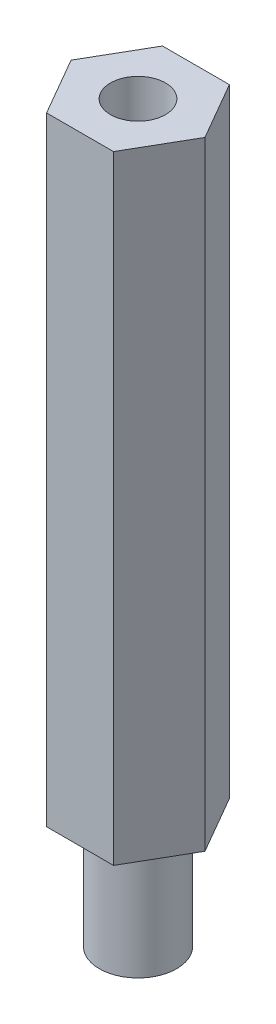
ISO-10303-21;
HEADER;
FILE_DESCRIPTION(('STEP AP214'),'2;1');
FILE_NAME('part.step','',(''),(''),'','','');
FILE_SCHEMA(('AUTOMOTIVE_DESIGN { 1 0 10303 214 1 1 1 1 }'));
ENDSEC;
DATA;
#1=APPLICATION_CONTEXT('core data for automotive mechanical design processes');
#2=APPLICATION_PROTOCOL_DEFINITION('international standard','automotive_design',2000,#1);
#3=PRODUCT_CONTEXT('',#1,'mechanical');
#4=PRODUCT('Part','Part','',(#3));
#5=PRODUCT_RELATED_PRODUCT_CATEGORY('part','',(#4));
#6=PRODUCT_DEFINITION_FORMATION('','',#4);
#7=PRODUCT_DEFINITION_CONTEXT('part definition',#1,'design');
#8=PRODUCT_DEFINITION('design','',#6,#7);
#9=PRODUCT_DEFINITION_SHAPE('','',#8);
#10=(LENGTH_UNIT() NAMED_UNIT(*) SI_UNIT(.MILLI.,.METRE.));
#11=(NAMED_UNIT(*) PLANE_ANGLE_UNIT() SI_UNIT($,.RADIAN.));
#12=(NAMED_UNIT(*) SI_UNIT($,.STERADIAN.) SOLID_ANGLE_UNIT());
#13=UNCERTAINTY_MEASURE_WITH_UNIT(LENGTH_MEASURE(1.E-05),#10,'distance_accuracy_value','');
#14=(GEOMETRIC_REPRESENTATION_CONTEXT(3) GLOBAL_UNCERTAINTY_ASSIGNED_CONTEXT((#13)) GLOBAL_UNIT_ASSIGNED_CONTEXT((#10,
#11,#12)) REPRESENTATION_CONTEXT('',''));
#15=CARTESIAN_POINT('',(0.,0.,0.));
#16=DIRECTION('',(0.,0.,1.));
#17=DIRECTION('',(1.,0.,0.));
#18=AXIS2_PLACEMENT_3D('',#15,#16,#17);
#19=CARTESIAN_POINT('',(0.,19.958347242,0.));
#20=DIRECTION('',(0.,1.,0.));
#21=DIRECTION('',(0.,0.,1.));
#22=AXIS2_PLACEMENT_3D('',#19,#20,#21);
#23=CONICAL_SURFACE('',#22,0.,1.02974425847309);
#24=CARTESIAN_POINT('',(0.,19.958347242,0.));
#25=VERTEX_POINT('',#24);
#26=VERTEX_LOOP('',#25);
#27=FACE_BOUND('',#26,.T.);
#28=CARTESIAN_POINT('',(0.,20.6375,0.));
#29=DIRECTION('',(0.,1.,0.));
#30=DIRECTION('',(0.,0.,1.));
#31=AXIS2_PLACEMENT_3D('',#28,#29,#30);
#32=CIRCLE('',#31,1.1303);
#33=CARTESIAN_POINT('',(0.,20.6375,1.1303));
#34=VERTEX_POINT('',#33);
#35=EDGE_CURVE('E88',#34,#34,#32,.F.);
#36=ORIENTED_EDGE('',*,*,#35,.F.);
#37=EDGE_LOOP('',(#36));
#38=FACE_BOUND('',#37,.T.);
#39=ADVANCED_FACE('F17',(#27,#38),#23,.F.);
#40=CARTESIAN_POINT('',(0.,20.6375,0.));
#41=DIRECTION('',(0.,1.,0.));
#42=DIRECTION('',(0.,0.,1.));
#43=AXIS2_PLACEMENT_3D('',#40,#41,#42);
#44=CYLINDRICAL_SURFACE('',#43,1.1303);
#45=ORIENTED_EDGE('',*,*,#35,.T.);
#46=EDGE_LOOP('',(#45));
#47=FACE_BOUND('',#46,.T.);
#48=CARTESIAN_POINT('',(0.,25.4,0.));
#49=DIRECTION('',(0.,1.,0.));
#50=DIRECTION('',(0.,0.,1.));
#51=AXIS2_PLACEMENT_3D('',#48,#49,#50);
#52=CIRCLE('',#51,1.1303);
#53=CARTESIAN_POINT('',(0.,25.4,1.1303));
#54=VERTEX_POINT('',#53);
#55=EDGE_CURVE('E21',#54,#54,#52,.T.);
#56=ORIENTED_EDGE('',*,*,#55,.T.);
#57=EDGE_LOOP('',(#56));
#58=FACE_BOUND('',#57,.T.);
#59=ADVANCED_FACE('F84',(#47,#58),#44,.F.);
#60=CARTESIAN_POINT('',(-2.782626225,25.4,2.38125));
#61=DIRECTION('',(0.,-1.,0.));
#62=DIRECTION('',(0.,0.,-1.));
#63=AXIS2_PLACEMENT_3D('',#60,#61,#62);
#64=PLANE('',#63);
#65=ORIENTED_EDGE('',*,*,#55,.F.);
#66=EDGE_LOOP('',(#65));
#67=FACE_BOUND('',#66,.T.);
#68=DIRECTION('',(0.499999999861491,0.,0.866025403864407));
#69=VECTOR('',#68,1.);
#70=CARTESIAN_POINT('',(-2.062222993,25.4,1.190625));
#71=LINE('',#70,#69);
#72=CARTESIAN_POINT('',(-2.74963065629974,25.4,6.71976851333161E-10));
#73=VERTEX_POINT('',#72);
#74=CARTESIAN_POINT('',(-1.3748153284377,25.4,2.38125));
#75=VERTEX_POINT('',#74);
#76=EDGE_CURVE('E65',#73,#75,#71,.T.);
#77=ORIENTED_EDGE('',*,*,#76,.T.);
#78=DIRECTION('',(1.,0.,0.));
#79=VECTOR('',#78,1.);
#80=CARTESIAN_POINT('',(0.,25.4,2.38125));
#81=LINE('',#80,#79);
#82=CARTESIAN_POINT('',(1.3748153284377,25.4,2.38125));
#83=VERTEX_POINT('',#82);
#84=EDGE_CURVE('E117',#75,#83,#81,.T.);
#85=ORIENTED_EDGE('',*,*,#84,.T.);
#86=DIRECTION('',(0.499999999861491,0.,-0.866025403864407));
#87=VECTOR('',#86,1.);
#88=CARTESIAN_POINT('',(2.062222993,25.4,1.190625));
#89=LINE('',#88,#87);
#90=CARTESIAN_POINT('',(2.74963065559947,25.4,-1.34395362135116E-09));
#91=VERTEX_POINT('',#90);
#92=EDGE_CURVE('E114',#83,#91,#89,.T.);
#93=ORIENTED_EDGE('',*,*,#92,.T.);
#94=DIRECTION('',(-0.499999999861491,0.,-0.866025403864407));
#95=VECTOR('',#94,1.);
#96=CARTESIAN_POINT('',(2.062222993,25.4,-1.190625));
#97=LINE('',#96,#95);
#98=CARTESIAN_POINT('',(1.3748153284377,25.4,-2.38125));
#99=VERTEX_POINT('',#98);
#100=EDGE_CURVE('E107',#91,#99,#97,.T.);
#101=ORIENTED_EDGE('',*,*,#100,.T.);
#102=DIRECTION('',(-1.,0.,0.));
#103=VECTOR('',#102,1.);
#104=CARTESIAN_POINT('',(0.,25.4,-2.38125));
#105=LINE('',#104,#103);
#106=CARTESIAN_POINT('',(-1.3748153284377,25.4,-2.38125));
#107=VERTEX_POINT('',#106);
#108=EDGE_CURVE('E78',#99,#107,#105,.T.);
#109=ORIENTED_EDGE('',*,*,#108,.T.);
#110=DIRECTION('',(-0.499999999861491,0.,0.866025403864407));
#111=VECTOR('',#110,1.);
#112=CARTESIAN_POINT('',(-2.062222993,25.4,-1.190625));
#113=LINE('',#112,#111);
#114=EDGE_CURVE('E92',#107,#73,#113,.T.);
#115=ORIENTED_EDGE('',*,*,#114,.T.);
#116=EDGE_LOOP('',(#77,#85,#93,#101,#109,#115));
#117=FACE_BOUND('',#116,.T.);
#118=ADVANCED_FACE('F168',(#67,#117),#64,.F.);
#119=CARTESIAN_POINT('',(-2.749630657,0.,0.));
#120=DIRECTION('',(0.866025403864407,0.,0.499999999861491));
#121=DIRECTION('',(0.499999999861491,0.,-0.866025403864407));
#122=AXIS2_PLACEMENT_3D('',#119,#120,#121);
#123=PLANE('',#122);
#124=DIRECTION('',(0.,1.,0.));
#125=VECTOR('',#124,1.);
#126=CARTESIAN_POINT('',(-2.749630657,12.7,0.));
#127=LINE('',#126,#125);
#128=CARTESIAN_POINT('',(-2.74963065614118,0.,-1.35229067527165E-10));
#129=VERTEX_POINT('',#128);
#130=EDGE_CURVE('E102',#129,#73,#127,.T.);
#131=ORIENTED_EDGE('',*,*,#130,.T.);
#132=ORIENTED_EDGE('',*,*,#114,.F.);
#133=DIRECTION('',(0.,-1.,0.));
#134=VECTOR('',#133,1.);
#135=CARTESIAN_POINT('',(-1.374815329,12.7,-2.38125));
#136=LINE('',#135,#134);
#137=CARTESIAN_POINT('',(-1.3748153284377,0.,-2.38125));
#138=VERTEX_POINT('',#137);
#139=EDGE_CURVE('E105',#107,#138,#136,.T.);
#140=ORIENTED_EDGE('',*,*,#139,.T.);
#141=DIRECTION('',(0.499999999827506,0.,-0.866025403884028));
#142=VECTOR('',#141,1.);
#143=CARTESIAN_POINT('',(-2.74963065575081,0.,0.));
#144=LINE('',#143,#142);
#145=EDGE_CURVE('E56',#129,#138,#144,.T.);
#146=ORIENTED_EDGE('',*,*,#145,.F.);
#147=EDGE_LOOP('',(#131,#132,#140,#146));
#148=FACE_BOUND('',#147,.T.);
#149=ADVANCED_FACE('F131',(#148),#123,.F.);
#150=CARTESIAN_POINT('',(-1.374815329,0.,-2.38125));
#151=DIRECTION('',(0.,0.,1.));
#152=DIRECTION('',(1.,0.,0.));
#153=AXIS2_PLACEMENT_3D('',#150,#151,#152);
#154=PLANE('',#153);
#155=ORIENTED_EDGE('',*,*,#139,.F.);
#156=ORIENTED_EDGE('',*,*,#108,.F.);
#157=DIRECTION('',(0.,-1.,0.));
#158=VECTOR('',#157,1.);
#159=CARTESIAN_POINT('',(1.374815329,12.7,-2.38125));
#160=LINE('',#159,#158);
#161=CARTESIAN_POINT('',(1.3748153284377,0.,-2.38125));
#162=VERTEX_POINT('',#161);
#163=EDGE_CURVE('E112',#99,#162,#160,.T.);
#164=ORIENTED_EDGE('',*,*,#163,.T.);
#165=DIRECTION('',(1.,0.,0.));
#166=VECTOR('',#165,1.);
#167=CARTESIAN_POINT('',(0.,0.,-2.38125));
#168=LINE('',#167,#166);
#169=EDGE_CURVE('E108',#138,#162,#168,.T.);
#170=ORIENTED_EDGE('',*,*,#169,.F.);
#171=EDGE_LOOP('',(#155,#156,#164,#170));
#172=FACE_BOUND('',#171,.T.);
#173=ADVANCED_FACE('F134',(#172),#154,.F.);
#174=CARTESIAN_POINT('',(1.374815329,0.,-2.38125));
#175=DIRECTION('',(-0.866025403864407,0.,0.499999999861491));
#176=DIRECTION('',(0.499999999861491,0.,0.866025403864407));
#177=AXIS2_PLACEMENT_3D('',#174,#175,#176);
#178=PLANE('',#177);
#179=ORIENTED_EDGE('',*,*,#163,.F.);
#180=ORIENTED_EDGE('',*,*,#100,.F.);
#181=DIRECTION('',(0.,-1.,0.));
#182=VECTOR('',#181,1.);
#183=CARTESIAN_POINT('',(2.749630657,12.7,0.));
#184=LINE('',#183,#182);
#185=CARTESIAN_POINT('',(2.74963065614118,0.,-1.35228892435423E-10));
#186=VERTEX_POINT('',#185);
#187=EDGE_CURVE('E115',#91,#186,#184,.T.);
#188=ORIENTED_EDGE('',*,*,#187,.T.);
#189=DIRECTION('',(0.499999999827506,0.,0.866025403884028));
#190=VECTOR('',#189,1.);
#191=CARTESIAN_POINT('',(1.3748153278754,0.,-2.38125));
#192=LINE('',#191,#190);
#193=EDGE_CURVE('E111',#162,#186,#192,.T.);
#194=ORIENTED_EDGE('',*,*,#193,.F.);
#195=EDGE_LOOP('',(#179,#180,#188,#194));
#196=FACE_BOUND('',#195,.T.);
#197=ADVANCED_FACE('F139',(#196),#178,.F.);
#198=CARTESIAN_POINT('',(2.749630657,0.,0.));
#199=DIRECTION('',(-0.866025403864407,0.,-0.499999999861491));
#200=DIRECTION('',(-0.499999999861491,0.,0.866025403864407));
#201=AXIS2_PLACEMENT_3D('',#198,#199,#200);
#202=PLANE('',#201);
#203=ORIENTED_EDGE('',*,*,#187,.F.);
#204=ORIENTED_EDGE('',*,*,#92,.F.);
#205=DIRECTION('',(0.,-1.,0.));
#206=VECTOR('',#205,1.);
#207=CARTESIAN_POINT('',(1.374815329,12.7,2.38125));
#208=LINE('',#207,#206);
#209=CARTESIAN_POINT('',(1.3748153284377,0.,2.38125));
#210=VERTEX_POINT('',#209);
#211=EDGE_CURVE('E104',#83,#210,#208,.T.);
#212=ORIENTED_EDGE('',*,*,#211,.T.);
#213=DIRECTION('',(-0.499999999827506,0.,0.866025403884028));
#214=VECTOR('',#213,1.);
#215=CARTESIAN_POINT('',(2.74963065575081,0.,0.));
#216=LINE('',#215,#214);
#217=EDGE_CURVE('E101',#186,#210,#216,.T.);
#218=ORIENTED_EDGE('',*,*,#217,.F.);
#219=EDGE_LOOP('',(#203,#204,#212,#218));
#220=FACE_BOUND('',#219,.T.);
#221=ADVANCED_FACE('F143',(#220),#202,.F.);
#222=CARTESIAN_POINT('',(1.374815329,0.,2.38125));
#223=DIRECTION('',(0.,0.,-1.));
#224=DIRECTION('',(-1.,0.,0.));
#225=AXIS2_PLACEMENT_3D('',#222,#223,#224);
#226=PLANE('',#225);
#227=ORIENTED_EDGE('',*,*,#211,.F.);
#228=ORIENTED_EDGE('',*,*,#84,.F.);
#229=DIRECTION('',(0.,-1.,0.));
#230=VECTOR('',#229,1.);
#231=CARTESIAN_POINT('',(-1.374815329,12.7,2.38125));
#232=LINE('',#231,#230);
#233=CARTESIAN_POINT('',(-1.3748153284377,0.,2.38125));
#234=VERTEX_POINT('',#233);
#235=EDGE_CURVE('E36',#75,#234,#232,.T.);
#236=ORIENTED_EDGE('',*,*,#235,.T.);
#237=DIRECTION('',(-1.,0.,0.));
#238=VECTOR('',#237,1.);
#239=CARTESIAN_POINT('',(0.,0.,2.38125));
#240=LINE('',#239,#238);
#241=EDGE_CURVE('E97',#210,#234,#240,.T.);
#242=ORIENTED_EDGE('',*,*,#241,.F.);
#243=EDGE_LOOP('',(#227,#228,#236,#242));
#244=FACE_BOUND('',#243,.T.);
#245=ADVANCED_FACE('F146',(#244),#226,.F.);
#246=CARTESIAN_POINT('',(-1.374815329,0.,2.38125));
#247=DIRECTION('',(0.866025403864407,0.,-0.499999999861491));
#248=DIRECTION('',(-0.499999999861491,0.,-0.866025403864407));
#249=AXIS2_PLACEMENT_3D('',#246,#247,#248);
#250=PLANE('',#249);
#251=ORIENTED_EDGE('',*,*,#235,.F.);
#252=ORIENTED_EDGE('',*,*,#76,.F.);
#253=ORIENTED_EDGE('',*,*,#130,.F.);
#254=DIRECTION('',(-0.499999999827506,0.,-0.866025403884028));
#255=VECTOR('',#254,1.);
#256=CARTESIAN_POINT('',(-1.3748153278754,0.,2.38125));
#257=LINE('',#256,#255);
#258=EDGE_CURVE('E100',#234,#129,#257,.T.);
#259=ORIENTED_EDGE('',*,*,#258,.F.);
#260=EDGE_LOOP('',(#251,#252,#253,#259));
#261=FACE_BOUND('',#260,.T.);
#262=ADVANCED_FACE('F130',(#261),#250,.F.);
#263=CARTESIAN_POINT('',(-2.782626225,0.,2.38125));
#264=DIRECTION('',(0.,-1.,0.));
#265=DIRECTION('',(0.,0.,-1.));
#266=AXIS2_PLACEMENT_3D('',#263,#264,#265);
#267=PLANE('',#266);
#268=CARTESIAN_POINT('',(0.,0.,0.));
#269=DIRECTION('',(0.,1.,0.));
#270=DIRECTION('',(0.,0.,1.));
#271=AXIS2_PLACEMENT_3D('',#268,#269,#270);
#272=CIRCLE('',#271,1.5875);
#273=CARTESIAN_POINT('',(0.,0.,1.5875));
#274=VERTEX_POINT('',#273);
#275=EDGE_CURVE('E27',#274,#274,#272,.T.);
#276=ORIENTED_EDGE('',*,*,#275,.T.);
#277=EDGE_LOOP('',(#276));
#278=FACE_BOUND('',#277,.T.);
#279=ORIENTED_EDGE('',*,*,#241,.T.);
#280=ORIENTED_EDGE('',*,*,#258,.T.);
#281=ORIENTED_EDGE('',*,*,#145,.T.);
#282=ORIENTED_EDGE('',*,*,#169,.T.);
#283=ORIENTED_EDGE('',*,*,#193,.T.);
#284=ORIENTED_EDGE('',*,*,#217,.T.);
#285=EDGE_LOOP('',(#279,#280,#281,#282,#283,#284));
#286=FACE_BOUND('',#285,.T.);
#287=ADVANCED_FACE('F127',(#278,#286),#267,.T.);
#288=CARTESIAN_POINT('',(-1.60655,-4.7625,1.60655));
#289=DIRECTION('',(0.,-1.,0.));
#290=DIRECTION('',(0.,0.,-1.));
#291=AXIS2_PLACEMENT_3D('',#288,#289,#290);
#292=PLANE('',#291);
#293=CARTESIAN_POINT('',(0.,-4.7625,0.));
#294=DIRECTION('',(0.,1.,0.));
#295=DIRECTION('',(0.,0.,1.));
#296=AXIS2_PLACEMENT_3D('',#293,#294,#295);
#297=CIRCLE('',#296,1.5875);
#298=CARTESIAN_POINT('',(0.,-4.7625,1.5875));
#299=VERTEX_POINT('',#298);
#300=EDGE_CURVE('E11',#299,#299,#297,.F.);
#301=ORIENTED_EDGE('',*,*,#300,.T.);
#302=EDGE_LOOP('',(#301));
#303=FACE_BOUND('',#302,.T.);
#304=ADVANCED_FACE('F19',(#303),#292,.T.);
#305=CARTESIAN_POINT('',(0.,-4.7625,0.));
#306=DIRECTION('',(0.,1.,0.));
#307=DIRECTION('',(0.,0.,1.));
#308=AXIS2_PLACEMENT_3D('',#305,#306,#307);
#309=CYLINDRICAL_SURFACE('',#308,1.5875);
#310=ORIENTED_EDGE('',*,*,#275,.F.);
#311=EDGE_LOOP('',(#310));
#312=FACE_BOUND('',#311,.T.);
#313=ORIENTED_EDGE('',*,*,#300,.F.);
#314=EDGE_LOOP('',(#313));
#315=FACE_BOUND('',#314,.T.);
#316=ADVANCED_FACE('F156',(#312,#315),#309,.T.);
#317=CLOSED_SHELL('',(#39,#59,#118,#149,#173,#197,#221,#245,#262,#287,#304,#316));
#318=MANIFOLD_SOLID_BREP('B1',#317);
#319=ADVANCED_BREP_SHAPE_REPRESENTATION('',(#18,#318),#14);
#320=SHAPE_DEFINITION_REPRESENTATION(#9,#319);
ENDSEC;
END-ISO-10303-21;
